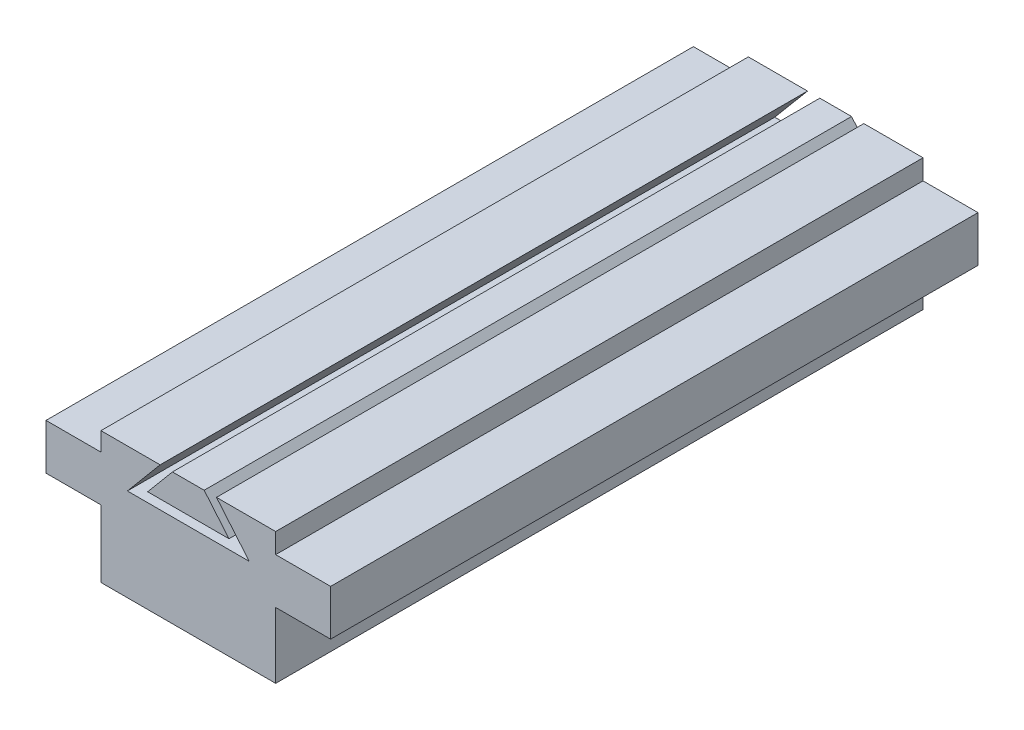
ISO-10303-21;
HEADER;
FILE_DESCRIPTION(('STEP AP214'),'2;1');
FILE_NAME('part.step','',(''),(''),'','','');
FILE_SCHEMA(('AUTOMOTIVE_DESIGN { 1 0 10303 214 1 1 1 1 }'));
ENDSEC;
DATA;
#1=APPLICATION_CONTEXT('core data for automotive mechanical design processes');
#2=APPLICATION_PROTOCOL_DEFINITION('international standard','automotive_design',2000,#1);
#3=PRODUCT_CONTEXT('',#1,'mechanical');
#4=PRODUCT('Part','Part','',(#3));
#5=PRODUCT_RELATED_PRODUCT_CATEGORY('part','',(#4));
#6=PRODUCT_DEFINITION_FORMATION('','',#4);
#7=PRODUCT_DEFINITION_CONTEXT('part definition',#1,'design');
#8=PRODUCT_DEFINITION('design','',#6,#7);
#9=PRODUCT_DEFINITION_SHAPE('','',#8);
#10=(LENGTH_UNIT() NAMED_UNIT(*) SI_UNIT(.MILLI.,.METRE.));
#11=(NAMED_UNIT(*) PLANE_ANGLE_UNIT() SI_UNIT($,.RADIAN.));
#12=(NAMED_UNIT(*) SI_UNIT($,.STERADIAN.) SOLID_ANGLE_UNIT());
#13=UNCERTAINTY_MEASURE_WITH_UNIT(LENGTH_MEASURE(1.E-05),#10,'distance_accuracy_value','');
#14=(GEOMETRIC_REPRESENTATION_CONTEXT(3) GLOBAL_UNCERTAINTY_ASSIGNED_CONTEXT((#13)) GLOBAL_UNIT_ASSIGNED_CONTEXT((#10,
#11,#12)) REPRESENTATION_CONTEXT('',''));
#15=CARTESIAN_POINT('',(0.,0.,0.));
#16=DIRECTION('',(0.,0.,1.));
#17=DIRECTION('',(1.,0.,0.));
#18=AXIS2_PLACEMENT_3D('',#15,#16,#17);
#19=CARTESIAN_POINT('',(2.3615959512271,0.,-5.91156217103304));
#20=DIRECTION('',(1.,0.,0.));
#21=DIRECTION('',(0.,1.,0.));
#22=AXIS2_PLACEMENT_3D('',#19,#20,#21);
#23=PLANE('',#22);
#24=DIRECTION('',(0.,1.,0.));
#25=VECTOR('',#24,1.);
#26=CARTESIAN_POINT('',(2.3615959512271,0.,0.));
#27=LINE('',#26,#25);
#28=CARTESIAN_POINT('',(2.3615959512271,-3.555000078,0.));
#29=VERTEX_POINT('',#28);
#30=CARTESIAN_POINT('',(2.3615959512271,-1.7770265920253,0.));
#31=VERTEX_POINT('',#30);
#32=EDGE_CURVE('E191',#29,#31,#27,.T.);
#33=ORIENTED_EDGE('',*,*,#32,.T.);
#34=DIRECTION('',(0.,0.,1.));
#35=VECTOR('',#34,1.);
#36=CARTESIAN_POINT('',(2.3615959512271,-1.7770265920253,-1.93215123491172));
#37=LINE('',#36,#35);
#38=CARTESIAN_POINT('',(2.3615959512271,-1.7770265920253,17.5));
#39=VERTEX_POINT('',#38);
#40=EDGE_CURVE('E185',#31,#39,#37,.T.);
#41=ORIENTED_EDGE('',*,*,#40,.T.);
#42=DIRECTION('',(0.,1.,0.));
#43=VECTOR('',#42,1.);
#44=CARTESIAN_POINT('',(2.3615959512271,0.,17.5));
#45=LINE('',#44,#43);
#46=CARTESIAN_POINT('',(2.3615959512271,-3.555000078,17.5));
#47=VERTEX_POINT('',#46);
#48=EDGE_CURVE('E278',#47,#39,#45,.T.);
#49=ORIENTED_EDGE('',*,*,#48,.F.);
#50=DIRECTION('',(0.,0.,1.));
#51=VECTOR('',#50,1.);
#52=CARTESIAN_POINT('',(2.3615959512271,-3.555000078,-5.91156217103304));
#53=LINE('',#52,#51);
#54=EDGE_CURVE('E192',#29,#47,#53,.T.);
#55=ORIENTED_EDGE('',*,*,#54,.F.);
#56=EDGE_LOOP('',(#33,#41,#49,#55));
#57=FACE_BOUND('',#56,.T.);
#58=ADVANCED_FACE('F51',(#57),#23,.T.);
#59=CARTESIAN_POINT('',(-2.36159595122709,-3.555000078,-5.91156217103304));
#60=DIRECTION('',(-1.,0.,0.));
#61=DIRECTION('',(0.,0.,1.));
#62=AXIS2_PLACEMENT_3D('',#59,#60,#61);
#63=PLANE('',#62);
#64=DIRECTION('',(0.,-1.,0.));
#65=VECTOR('',#64,1.);
#66=CARTESIAN_POINT('',(-2.36159595122709,-3.555000078,0.));
#67=LINE('',#66,#65);
#68=CARTESIAN_POINT('',(-2.36159595122709,0.,0.));
#69=VERTEX_POINT('',#68);
#70=CARTESIAN_POINT('',(-2.36159595122709,-0.502629726502587,0.));
#71=VERTEX_POINT('',#70);
#72=EDGE_CURVE('E225',#69,#71,#67,.T.);
#73=ORIENTED_EDGE('',*,*,#72,.T.);
#74=DIRECTION('',(0.,0.,1.));
#75=VECTOR('',#74,1.);
#76=CARTESIAN_POINT('',(-2.36159595122709,-0.502629726502587,-1.93215123491172));
#77=LINE('',#76,#75);
#78=CARTESIAN_POINT('',(-2.36159595122709,-0.502629726502587,17.5));
#79=VERTEX_POINT('',#78);
#80=EDGE_CURVE('E296',#71,#79,#77,.T.);
#81=ORIENTED_EDGE('',*,*,#80,.T.);
#82=DIRECTION('',(0.,-1.,0.));
#83=VECTOR('',#82,1.);
#84=CARTESIAN_POINT('',(-2.36159595122709,-3.555000078,17.5));
#85=LINE('',#84,#83);
#86=CARTESIAN_POINT('',(-2.36159595122709,0.,17.5));
#87=VERTEX_POINT('',#86);
#88=EDGE_CURVE('E288',#87,#79,#85,.T.);
#89=ORIENTED_EDGE('',*,*,#88,.F.);
#90=DIRECTION('',(0.,0.,1.));
#91=VECTOR('',#90,1.);
#92=CARTESIAN_POINT('',(-2.36159595122709,0.,-5.91156217103304));
#93=LINE('',#92,#91);
#94=EDGE_CURVE('E12',#69,#87,#93,.T.);
#95=ORIENTED_EDGE('',*,*,#94,.F.);
#96=EDGE_LOOP('',(#73,#81,#89,#95));
#97=FACE_BOUND('',#96,.T.);
#98=ADVANCED_FACE('F313',(#97),#63,.T.);
#99=CARTESIAN_POINT('',(0.,0.,0.));
#100=DIRECTION('',(0.,0.,-1.));
#101=DIRECTION('',(-1.,0.,0.));
#102=AXIS2_PLACEMENT_3D('',#99,#100,#101);
#103=PLANE('',#102);
#104=DIRECTION('',(-1.,0.,0.));
#105=VECTOR('',#104,1.);
#106=CARTESIAN_POINT('',(-2.36159595122709,0.,0.));
#107=LINE('',#106,#105);
#108=CARTESIAN_POINT('',(-0.761599151227094,0.,0.));
#109=VERTEX_POINT('',#108);
#110=EDGE_CURVE('E60',#109,#69,#107,.T.);
#111=ORIENTED_EDGE('',*,*,#110,.F.);
#112=DIRECTION('',(0.642787609686538,0.766044443118979,0.));
#113=VECTOR('',#112,1.);
#114=CARTESIAN_POINT('',(-0.761599151227094,0.,0.));
#115=LINE('',#114,#113);
#116=CARTESIAN_POINT('',(-1.64684926044092,-1.054999998,0.));
#117=VERTEX_POINT('',#116);
#118=EDGE_CURVE('E210',#117,#109,#115,.T.);
#119=ORIENTED_EDGE('',*,*,#118,.F.);
#120=DIRECTION('',(-1.,0.,0.));
#121=VECTOR('',#120,1.);
#122=CARTESIAN_POINT('',(-1.64684926044092,-1.054999998,0.));
#123=LINE('',#122,#121);
#124=CARTESIAN_POINT('',(1.64684926044092,-1.054999998,0.));
#125=VERTEX_POINT('',#124);
#126=EDGE_CURVE('E214',#125,#117,#123,.T.);
#127=ORIENTED_EDGE('',*,*,#126,.F.);
#128=DIRECTION('',(0.642787609686539,-0.766044443118979,0.));
#129=VECTOR('',#128,1.);
#130=CARTESIAN_POINT('',(1.64684926044092,-1.054999998,0.));
#131=LINE('',#130,#129);
#132=CARTESIAN_POINT('',(0.761599151227095,0.,0.));
#133=VERTEX_POINT('',#132);
#134=EDGE_CURVE('E218',#133,#125,#131,.T.);
#135=ORIENTED_EDGE('',*,*,#134,.F.);
#136=DIRECTION('',(-1.,0.,0.));
#137=VECTOR('',#136,1.);
#138=CARTESIAN_POINT('',(0.761599151227095,0.,0.));
#139=LINE('',#138,#137);
#140=CARTESIAN_POINT('',(2.3615959512271,0.,0.));
#141=VERTEX_POINT('',#140);
#142=EDGE_CURVE('E188',#141,#133,#139,.T.);
#143=ORIENTED_EDGE('',*,*,#142,.F.);
#144=CARTESIAN_POINT('',(2.3615959512271,-0.541379584025303,0.));
#145=VERTEX_POINT('',#144);
#146=EDGE_CURVE('E181',#145,#141,#27,.T.);
#147=ORIENTED_EDGE('',*,*,#146,.F.);
#148=DIRECTION('',(-1.,0.,0.));
#149=VECTOR('',#148,1.);
#150=CARTESIAN_POINT('',(3.8469864272271,-0.541379584025303,0.));
#151=LINE('',#150,#149);
#152=CARTESIAN_POINT('',(3.8469864272271,-0.541379584025303,0.));
#153=VERTEX_POINT('',#152);
#154=EDGE_CURVE('E165',#153,#145,#151,.T.);
#155=ORIENTED_EDGE('',*,*,#154,.F.);
#156=DIRECTION('',(0.,1.,0.));
#157=VECTOR('',#156,1.);
#158=CARTESIAN_POINT('',(3.8469864272271,-0.541379584025303,0.));
#159=LINE('',#158,#157);
#160=CARTESIAN_POINT('',(3.8469864272271,-1.7770265920253,0.));
#161=VERTEX_POINT('',#160);
#162=EDGE_CURVE('E352',#161,#153,#159,.T.);
#163=ORIENTED_EDGE('',*,*,#162,.F.);
#164=DIRECTION('',(1.,0.,0.));
#165=VECTOR('',#164,1.);
#166=CARTESIAN_POINT('',(3.8469864272271,-1.7770265920253,0.));
#167=LINE('',#166,#165);
#168=EDGE_CURVE('E343',#31,#161,#167,.T.);
#169=ORIENTED_EDGE('',*,*,#168,.F.);
#170=ORIENTED_EDGE('',*,*,#32,.F.);
#171=DIRECTION('',(1.,0.,0.));
#172=VECTOR('',#171,1.);
#173=CARTESIAN_POINT('',(2.3615959512271,-3.555000078,0.));
#174=LINE('',#173,#172);
#175=CARTESIAN_POINT('',(-2.36159595122709,-3.555000078,0.));
#176=VERTEX_POINT('',#175);
#177=EDGE_CURVE('E198',#176,#29,#174,.T.);
#178=ORIENTED_EDGE('',*,*,#177,.F.);
#179=CARTESIAN_POINT('',(-2.36159595122709,-1.73827673450259,0.));
#180=VERTEX_POINT('',#179);
#181=EDGE_CURVE('E232',#180,#176,#67,.T.);
#182=ORIENTED_EDGE('',*,*,#181,.F.);
#183=DIRECTION('',(1.,0.,0.));
#184=VECTOR('',#183,1.);
#185=CARTESIAN_POINT('',(-2.36159595122709,-1.73827673450259,0.));
#186=LINE('',#185,#184);
#187=CARTESIAN_POINT('',(-3.84698642722709,-1.73827673450259,0.));
#188=VERTEX_POINT('',#187);
#189=EDGE_CURVE('E302',#188,#180,#186,.T.);
#190=ORIENTED_EDGE('',*,*,#189,.F.);
#191=DIRECTION('',(0.,-1.,0.));
#192=VECTOR('',#191,1.);
#193=CARTESIAN_POINT('',(-3.84698642722709,-0.502629726502587,0.));
#194=LINE('',#193,#192);
#195=CARTESIAN_POINT('',(-3.84698642722709,-0.502629726502587,0.));
#196=VERTEX_POINT('',#195);
#197=EDGE_CURVE('E369',#196,#188,#194,.T.);
#198=ORIENTED_EDGE('',*,*,#197,.F.);
#199=DIRECTION('',(-1.,0.,0.));
#200=VECTOR('',#199,1.);
#201=CARTESIAN_POINT('',(-2.36159595122709,-0.502629726502587,0.));
#202=LINE('',#201,#200);
#203=EDGE_CURVE('E356',#71,#196,#202,.T.);
#204=ORIENTED_EDGE('',*,*,#203,.F.);
#205=ORIENTED_EDGE('',*,*,#72,.F.);
#206=EDGE_LOOP('',(#111,#119,#127,#135,#143,#147,#155,#163,#169,#170,#178,#182,#190,#198,#204,#205));
#207=FACE_BOUND('',#206,.T.);
#208=ADVANCED_FACE('F53',(#207),#103,.T.);
#209=CARTESIAN_POINT('',(0.,0.,17.5));
#210=DIRECTION('',(0.,0.,-1.));
#211=DIRECTION('',(-1.,0.,0.));
#212=AXIS2_PLACEMENT_3D('',#209,#210,#211);
#213=PLANE('',#212);
#214=DIRECTION('',(-1.,0.,0.));
#215=VECTOR('',#214,1.);
#216=CARTESIAN_POINT('',(-2.36159595122709,0.,17.5));
#217=LINE('',#216,#215);
#218=CARTESIAN_POINT('',(-0.761599151227094,0.,17.5));
#219=VERTEX_POINT('',#218);
#220=EDGE_CURVE('E240',#219,#87,#217,.T.);
#221=ORIENTED_EDGE('',*,*,#220,.T.);
#222=ORIENTED_EDGE('',*,*,#88,.T.);
#223=DIRECTION('',(-1.,0.,0.));
#224=VECTOR('',#223,1.);
#225=CARTESIAN_POINT('',(-2.36159595122709,-0.502629726502587,17.5));
#226=LINE('',#225,#224);
#227=CARTESIAN_POINT('',(-3.84698642722709,-0.502629726502587,17.5));
#228=VERTEX_POINT('',#227);
#229=EDGE_CURVE('E75',#79,#228,#226,.T.);
#230=ORIENTED_EDGE('',*,*,#229,.T.);
#231=DIRECTION('',(0.,-1.,0.));
#232=VECTOR('',#231,1.);
#233=CARTESIAN_POINT('',(-3.84698642722709,-0.502629726502587,17.5));
#234=LINE('',#233,#232);
#235=CARTESIAN_POINT('',(-3.84698642722709,-1.73827673450259,17.5));
#236=VERTEX_POINT('',#235);
#237=EDGE_CURVE('E357',#228,#236,#234,.T.);
#238=ORIENTED_EDGE('',*,*,#237,.T.);
#239=DIRECTION('',(1.,0.,0.));
#240=VECTOR('',#239,1.);
#241=CARTESIAN_POINT('',(-2.36159595122709,-1.73827673450259,17.5));
#242=LINE('',#241,#240);
#243=CARTESIAN_POINT('',(-2.36159595122709,-1.73827673450259,17.5));
#244=VERTEX_POINT('',#243);
#245=EDGE_CURVE('E353',#236,#244,#242,.T.);
#246=ORIENTED_EDGE('',*,*,#245,.T.);
#247=CARTESIAN_POINT('',(-2.36159595122709,-3.555000078,17.5));
#248=VERTEX_POINT('',#247);
#249=EDGE_CURVE('E291',#244,#248,#85,.T.);
#250=ORIENTED_EDGE('',*,*,#249,.T.);
#251=DIRECTION('',(1.,0.,0.));
#252=VECTOR('',#251,1.);
#253=CARTESIAN_POINT('',(2.3615959512271,-3.555000078,17.5));
#254=LINE('',#253,#252);
#255=EDGE_CURVE('E285',#248,#47,#254,.T.);
#256=ORIENTED_EDGE('',*,*,#255,.T.);
#257=ORIENTED_EDGE('',*,*,#48,.T.);
#258=DIRECTION('',(1.,0.,0.));
#259=VECTOR('',#258,1.);
#260=CARTESIAN_POINT('',(3.8469864272271,-1.7770265920253,17.5));
#261=LINE('',#260,#259);
#262=CARTESIAN_POINT('',(3.8469864272271,-1.7770265920253,17.5));
#263=VERTEX_POINT('',#262);
#264=EDGE_CURVE('E67',#39,#263,#261,.T.);
#265=ORIENTED_EDGE('',*,*,#264,.T.);
#266=DIRECTION('',(0.,1.,0.));
#267=VECTOR('',#266,1.);
#268=CARTESIAN_POINT('',(3.8469864272271,-0.541379584025303,17.5));
#269=LINE('',#268,#267);
#270=CARTESIAN_POINT('',(3.8469864272271,-0.541379584025303,17.5));
#271=VERTEX_POINT('',#270);
#272=EDGE_CURVE('E572',#263,#271,#269,.T.);
#273=ORIENTED_EDGE('',*,*,#272,.T.);
#274=DIRECTION('',(-1.,0.,0.));
#275=VECTOR('',#274,1.);
#276=CARTESIAN_POINT('',(3.8469864272271,-0.541379584025303,17.5));
#277=LINE('',#276,#275);
#278=CARTESIAN_POINT('',(2.3615959512271,-0.541379584025303,17.5));
#279=VERTEX_POINT('',#278);
#280=EDGE_CURVE('E576',#271,#279,#277,.T.);
#281=ORIENTED_EDGE('',*,*,#280,.T.);
#282=CARTESIAN_POINT('',(2.3615959512271,0.,17.5));
#283=VERTEX_POINT('',#282);
#284=EDGE_CURVE('E183',#279,#283,#45,.T.);
#285=ORIENTED_EDGE('',*,*,#284,.T.);
#286=DIRECTION('',(-1.,0.,0.));
#287=VECTOR('',#286,1.);
#288=CARTESIAN_POINT('',(0.761599151227095,0.,17.5));
#289=LINE('',#288,#287);
#290=CARTESIAN_POINT('',(0.761599151227095,0.,17.5));
#291=VERTEX_POINT('',#290);
#292=EDGE_CURVE('E274',#283,#291,#289,.T.);
#293=ORIENTED_EDGE('',*,*,#292,.T.);
#294=DIRECTION('',(0.642787609686539,-0.766044443118979,0.));
#295=VECTOR('',#294,1.);
#296=CARTESIAN_POINT('',(1.64684926044092,-1.054999998,17.5));
#297=LINE('',#296,#295);
#298=CARTESIAN_POINT('',(1.64684926044092,-1.054999998,17.5));
#299=VERTEX_POINT('',#298);
#300=EDGE_CURVE('E268',#291,#299,#297,.T.);
#301=ORIENTED_EDGE('',*,*,#300,.T.);
#302=DIRECTION('',(-1.,0.,0.));
#303=VECTOR('',#302,1.);
#304=CARTESIAN_POINT('',(-1.64684926044092,-1.054999998,17.5));
#305=LINE('',#304,#303);
#306=CARTESIAN_POINT('',(-1.64684926044092,-1.054999998,17.5));
#307=VERTEX_POINT('',#306);
#308=EDGE_CURVE('E262',#299,#307,#305,.T.);
#309=ORIENTED_EDGE('',*,*,#308,.T.);
#310=DIRECTION('',(0.642787609686538,0.766044443118979,0.));
#311=VECTOR('',#310,1.);
#312=CARTESIAN_POINT('',(-0.761599151227094,0.,17.5));
#313=LINE('',#312,#311);
#314=EDGE_CURVE('E237',#307,#219,#313,.T.);
#315=ORIENTED_EDGE('',*,*,#314,.T.);
#316=EDGE_LOOP('',(#221,#222,#230,#238,#246,#250,#256,#257,#265,#273,#281,#285,#293,#301,#309,#315));
#317=FACE_BOUND('',#316,.T.);
#318=ADVANCED_FACE('F272',(#317),#213,.F.);
#319=DIRECTION('',(0.,0.,1.));
#320=VECTOR('',#319,1.);
#321=CARTESIAN_POINT('',(-2.36159595122709,-1.73827673450259,-1.93215123491172));
#322=LINE('',#321,#320);
#323=EDGE_CURVE('E299',#180,#244,#322,.T.);
#324=ORIENTED_EDGE('',*,*,#323,.F.);
#325=ORIENTED_EDGE('',*,*,#181,.T.);
#326=DIRECTION('',(0.,0.,1.));
#327=VECTOR('',#326,1.);
#328=CARTESIAN_POINT('',(-2.36159595122709,-3.555000078,-5.91156217103304));
#329=LINE('',#328,#327);
#330=EDGE_CURVE('E206',#176,#248,#329,.T.);
#331=ORIENTED_EDGE('',*,*,#330,.T.);
#332=ORIENTED_EDGE('',*,*,#249,.F.);
#333=EDGE_LOOP('',(#324,#325,#331,#332));
#334=FACE_BOUND('',#333,.T.);
#335=ADVANCED_FACE('F315',(#334),#63,.T.);
#336=CARTESIAN_POINT('',(2.3615959512271,-3.555000078,-5.91156217103304));
#337=DIRECTION('',(0.,-1.,0.));
#338=DIRECTION('',(1.,0.,0.));
#339=AXIS2_PLACEMENT_3D('',#336,#337,#338);
#340=PLANE('',#339);
#341=CARTESIAN_POINT('',(0.,-3.555000078,16.0870141807737));
#342=DIRECTION('',(0.,-1.,0.));
#343=DIRECTION('',(1.,0.,0.));
#344=AXIS2_PLACEMENT_3D('',#341,#342,#343);
#345=CIRCLE('',#344,0.677079946819119);
#346=CARTESIAN_POINT('',(0.67707994681912,-3.555000078,16.0870141807737));
#347=VERTEX_POINT('',#346);
#348=EDGE_CURVE('E567',#347,#347,#345,.T.);
#349=ORIENTED_EDGE('',*,*,#348,.F.);
#350=EDGE_LOOP('',(#349));
#351=FACE_BOUND('',#350,.T.);
#352=CARTESIAN_POINT('',(0.,-3.555000078,12.2770141807737));
#353=DIRECTION('',(0.,-1.,0.));
#354=DIRECTION('',(1.,0.,0.));
#355=AXIS2_PLACEMENT_3D('',#352,#353,#354);
#356=CIRCLE('',#355,0.677079946819119);
#357=CARTESIAN_POINT('',(0.677079946819119,-3.555000078,12.2770141807737));
#358=VERTEX_POINT('',#357);
#359=EDGE_CURVE('E581',#358,#358,#356,.T.);
#360=ORIENTED_EDGE('',*,*,#359,.F.);
#361=EDGE_LOOP('',(#360));
#362=FACE_BOUND('',#361,.T.);
#363=CARTESIAN_POINT('',(0.,-3.555000078,8.46701418077369));
#364=DIRECTION('',(0.,-1.,0.));
#365=DIRECTION('',(1.,0.,0.));
#366=AXIS2_PLACEMENT_3D('',#363,#364,#365);
#367=CIRCLE('',#366,0.677079946819119);
#368=CARTESIAN_POINT('',(0.677079946819119,-3.555000078,8.46701418077369));
#369=VERTEX_POINT('',#368);
#370=EDGE_CURVE('E589',#369,#369,#367,.T.);
#371=ORIENTED_EDGE('',*,*,#370,.F.);
#372=EDGE_LOOP('',(#371));
#373=FACE_BOUND('',#372,.T.);
#374=CARTESIAN_POINT('',(0.,-3.555000078,4.65701418077369));
#375=DIRECTION('',(0.,-1.,0.));
#376=DIRECTION('',(1.,0.,0.));
#377=AXIS2_PLACEMENT_3D('',#374,#375,#376);
#378=CIRCLE('',#377,0.677079946819119);
#379=CARTESIAN_POINT('',(0.677079946819119,-3.555000078,4.65701418077369));
#380=VERTEX_POINT('',#379);
#381=EDGE_CURVE('E597',#380,#380,#378,.T.);
#382=ORIENTED_EDGE('',*,*,#381,.F.);
#383=EDGE_LOOP('',(#382));
#384=FACE_BOUND('',#383,.T.);
#385=ORIENTED_EDGE('',*,*,#330,.F.);
#386=ORIENTED_EDGE('',*,*,#177,.T.);
#387=ORIENTED_EDGE('',*,*,#54,.T.);
#388=ORIENTED_EDGE('',*,*,#255,.F.);
#389=EDGE_LOOP('',(#385,#386,#387,#388));
#390=FACE_BOUND('',#389,.T.);
#391=ADVANCED_FACE('F324',(#351,#362,#373,#384,#390),#340,.T.);
#392=DIRECTION('',(0.,0.,1.));
#393=VECTOR('',#392,1.);
#394=CARTESIAN_POINT('',(2.3615959512271,-0.541379584025303,-1.93215123491172));
#395=LINE('',#394,#393);
#396=EDGE_CURVE('E169',#145,#279,#395,.T.);
#397=ORIENTED_EDGE('',*,*,#396,.F.);
#398=ORIENTED_EDGE('',*,*,#146,.T.);
#399=DIRECTION('',(0.,0.,1.));
#400=VECTOR('',#399,1.);
#401=CARTESIAN_POINT('',(2.3615959512271,0.,-5.91156217103304));
#402=LINE('',#401,#400);
#403=EDGE_CURVE('E197',#141,#283,#402,.T.);
#404=ORIENTED_EDGE('',*,*,#403,.T.);
#405=ORIENTED_EDGE('',*,*,#284,.F.);
#406=EDGE_LOOP('',(#397,#398,#404,#405));
#407=FACE_BOUND('',#406,.T.);
#408=ADVANCED_FACE('F179',(#407),#23,.T.);
#409=CARTESIAN_POINT('',(0.761599151227095,0.,-5.91156217103304));
#410=DIRECTION('',(0.,1.,0.));
#411=DIRECTION('',(0.,0.,1.));
#412=AXIS2_PLACEMENT_3D('',#409,#410,#411);
#413=PLANE('',#412);
#414=ORIENTED_EDGE('',*,*,#403,.F.);
#415=ORIENTED_EDGE('',*,*,#142,.T.);
#416=DIRECTION('',(0.,0.,1.));
#417=VECTOR('',#416,1.);
#418=CARTESIAN_POINT('',(0.761599151227095,0.,-5.91156217103304));
#419=LINE('',#418,#417);
#420=EDGE_CURVE('E219',#133,#291,#419,.T.);
#421=ORIENTED_EDGE('',*,*,#420,.T.);
#422=ORIENTED_EDGE('',*,*,#292,.F.);
#423=EDGE_LOOP('',(#414,#415,#421,#422));
#424=FACE_BOUND('',#423,.T.);
#425=ADVANCED_FACE('F401',(#424),#413,.T.);
#426=CARTESIAN_POINT('',(1.64684926044092,-1.054999998,-5.91156217103304));
#427=DIRECTION('',(-0.766044443118979,-0.642787609686539,0.));
#428=DIRECTION('',(0.642787609686539,-0.766044443118979,0.));
#429=AXIS2_PLACEMENT_3D('',#426,#427,#428);
#430=PLANE('',#429);
#431=ORIENTED_EDGE('',*,*,#420,.F.);
#432=ORIENTED_EDGE('',*,*,#134,.T.);
#433=DIRECTION('',(0.,0.,1.));
#434=VECTOR('',#433,1.);
#435=CARTESIAN_POINT('',(1.64684926044092,-1.054999998,-5.91156217103304));
#436=LINE('',#435,#434);
#437=EDGE_CURVE('E215',#125,#299,#436,.T.);
#438=ORIENTED_EDGE('',*,*,#437,.T.);
#439=ORIENTED_EDGE('',*,*,#300,.F.);
#440=EDGE_LOOP('',(#431,#432,#438,#439));
#441=FACE_BOUND('',#440,.T.);
#442=ADVANCED_FACE('F254',(#441),#430,.T.);
#443=CARTESIAN_POINT('',(-1.64684926044092,-1.054999998,-5.91156217103304));
#444=DIRECTION('',(0.,1.,0.));
#445=DIRECTION('',(0.,0.,1.));
#446=AXIS2_PLACEMENT_3D('',#443,#444,#445);
#447=PLANE('',#446);
#448=CARTESIAN_POINT('',(0.,-1.054999998,16.0870141807737));
#449=DIRECTION('',(0.,1.,0.));
#450=DIRECTION('',(0.,0.,1.));
#451=AXIS2_PLACEMENT_3D('',#448,#449,#450);
#452=CIRCLE('',#451,0.677079946819119);
#453=CARTESIAN_POINT('',(0.,-1.054999998,16.7640941275928));
#454=VERTEX_POINT('',#453);
#455=EDGE_CURVE('E570',#454,#454,#452,.F.);
#456=ORIENTED_EDGE('',*,*,#455,.T.);
#457=EDGE_LOOP('',(#456));
#458=FACE_BOUND('',#457,.T.);
#459=CARTESIAN_POINT('',(0.,-1.054999998,12.2770141807737));
#460=DIRECTION('',(0.,1.,0.));
#461=DIRECTION('',(0.,0.,1.));
#462=AXIS2_PLACEMENT_3D('',#459,#460,#461);
#463=CIRCLE('',#462,0.677079946819119);
#464=CARTESIAN_POINT('',(0.,-1.054999998,12.9540941275928));
#465=VERTEX_POINT('',#464);
#466=EDGE_CURVE('E578',#465,#465,#463,.F.);
#467=ORIENTED_EDGE('',*,*,#466,.T.);
#468=EDGE_LOOP('',(#467));
#469=FACE_BOUND('',#468,.T.);
#470=CARTESIAN_POINT('',(0.,-1.054999998,8.46701418077369));
#471=DIRECTION('',(0.,1.,0.));
#472=DIRECTION('',(0.,0.,1.));
#473=AXIS2_PLACEMENT_3D('',#470,#471,#472);
#474=CIRCLE('',#473,0.677079946819119);
#475=CARTESIAN_POINT('',(0.,-1.054999998,9.14409412759281));
#476=VERTEX_POINT('',#475);
#477=EDGE_CURVE('E585',#476,#476,#474,.F.);
#478=ORIENTED_EDGE('',*,*,#477,.T.);
#479=EDGE_LOOP('',(#478));
#480=FACE_BOUND('',#479,.T.);
#481=CARTESIAN_POINT('',(0.,-1.054999998,4.65701418077369));
#482=DIRECTION('',(0.,1.,0.));
#483=DIRECTION('',(0.,0.,1.));
#484=AXIS2_PLACEMENT_3D('',#481,#482,#483);
#485=CIRCLE('',#484,0.677079946819119);
#486=CARTESIAN_POINT('',(0.,-1.054999998,5.33409412759281));
#487=VERTEX_POINT('',#486);
#488=EDGE_CURVE('E593',#487,#487,#485,.F.);
#489=ORIENTED_EDGE('',*,*,#488,.T.);
#490=EDGE_LOOP('',(#489));
#491=FACE_BOUND('',#490,.T.);
#492=ORIENTED_EDGE('',*,*,#437,.F.);
#493=ORIENTED_EDGE('',*,*,#126,.T.);
#494=DIRECTION('',(0.,0.,1.));
#495=VECTOR('',#494,1.);
#496=CARTESIAN_POINT('',(-1.64684926044092,-1.054999998,-5.91156217103304));
#497=LINE('',#496,#495);
#498=EDGE_CURVE('E211',#117,#307,#497,.T.);
#499=ORIENTED_EDGE('',*,*,#498,.T.);
#500=ORIENTED_EDGE('',*,*,#308,.F.);
#501=EDGE_LOOP('',(#492,#493,#499,#500));
#502=FACE_BOUND('',#501,.T.);
#503=ADVANCED_FACE('F260',(#458,#469,#480,#491,#502),#447,.T.);
#504=CARTESIAN_POINT('',(-0.761599151227094,0.,-5.91156217103304));
#505=DIRECTION('',(0.766044443118979,-0.642787609686538,0.));
#506=DIRECTION('',(0.642787609686538,0.766044443118979,0.));
#507=AXIS2_PLACEMENT_3D('',#504,#505,#506);
#508=PLANE('',#507);
#509=ORIENTED_EDGE('',*,*,#498,.F.);
#510=ORIENTED_EDGE('',*,*,#118,.T.);
#511=DIRECTION('',(0.,0.,1.));
#512=VECTOR('',#511,1.);
#513=CARTESIAN_POINT('',(-0.761599151227094,0.,-5.91156217103304));
#514=LINE('',#513,#512);
#515=EDGE_CURVE('E207',#109,#219,#514,.T.);
#516=ORIENTED_EDGE('',*,*,#515,.T.);
#517=ORIENTED_EDGE('',*,*,#314,.F.);
#518=EDGE_LOOP('',(#509,#510,#516,#517));
#519=FACE_BOUND('',#518,.T.);
#520=ADVANCED_FACE('F309',(#519),#508,.T.);
#521=CARTESIAN_POINT('',(-2.36159595122709,0.,-5.91156217103304));
#522=DIRECTION('',(0.,1.,0.));
#523=DIRECTION('',(0.,0.,1.));
#524=AXIS2_PLACEMENT_3D('',#521,#522,#523);
#525=PLANE('',#524);
#526=ORIENTED_EDGE('',*,*,#515,.F.);
#527=ORIENTED_EDGE('',*,*,#110,.T.);
#528=ORIENTED_EDGE('',*,*,#94,.T.);
#529=ORIENTED_EDGE('',*,*,#220,.F.);
#530=EDGE_LOOP('',(#526,#527,#528,#529));
#531=FACE_BOUND('',#530,.T.);
#532=ADVANCED_FACE('F312',(#531),#525,.T.);
#533=CARTESIAN_POINT('',(-2.36159595122709,-0.502629726502587,-1.93215123491172));
#534=DIRECTION('',(0.,1.,0.));
#535=DIRECTION('',(-1.,0.,0.));
#536=AXIS2_PLACEMENT_3D('',#533,#534,#535);
#537=PLANE('',#536);
#538=ORIENTED_EDGE('',*,*,#80,.F.);
#539=ORIENTED_EDGE('',*,*,#203,.T.);
#540=DIRECTION('',(0.,0.,1.));
#541=VECTOR('',#540,1.);
#542=CARTESIAN_POINT('',(-3.84698642722709,-0.502629726502587,-1.93215123491172));
#543=LINE('',#542,#541);
#544=EDGE_CURVE('E305',#196,#228,#543,.T.);
#545=ORIENTED_EDGE('',*,*,#544,.T.);
#546=ORIENTED_EDGE('',*,*,#229,.F.);
#547=EDGE_LOOP('',(#538,#539,#545,#546));
#548=FACE_BOUND('',#547,.T.);
#549=ADVANCED_FACE('F386',(#548),#537,.T.);
#550=CARTESIAN_POINT('',(-3.84698642722709,-0.502629726502587,-1.93215123491172));
#551=DIRECTION('',(-1.,0.,0.));
#552=DIRECTION('',(0.,0.,1.));
#553=AXIS2_PLACEMENT_3D('',#550,#551,#552);
#554=PLANE('',#553);
#555=ORIENTED_EDGE('',*,*,#544,.F.);
#556=ORIENTED_EDGE('',*,*,#197,.T.);
#557=DIRECTION('',(0.,0.,1.));
#558=VECTOR('',#557,1.);
#559=CARTESIAN_POINT('',(-3.84698642722709,-1.73827673450259,-1.93215123491172));
#560=LINE('',#559,#558);
#561=EDGE_CURVE('E368',#188,#236,#560,.T.);
#562=ORIENTED_EDGE('',*,*,#561,.T.);
#563=ORIENTED_EDGE('',*,*,#237,.F.);
#564=EDGE_LOOP('',(#555,#556,#562,#563));
#565=FACE_BOUND('',#564,.T.);
#566=ADVANCED_FACE('F376',(#565),#554,.T.);
#567=CARTESIAN_POINT('',(-2.36159595122709,-1.73827673450259,-1.93215123491172));
#568=DIRECTION('',(0.,-1.,0.));
#569=DIRECTION('',(1.,0.,0.));
#570=AXIS2_PLACEMENT_3D('',#567,#568,#569);
#571=PLANE('',#570);
#572=ORIENTED_EDGE('',*,*,#561,.F.);
#573=ORIENTED_EDGE('',*,*,#189,.T.);
#574=ORIENTED_EDGE('',*,*,#323,.T.);
#575=ORIENTED_EDGE('',*,*,#245,.F.);
#576=EDGE_LOOP('',(#572,#573,#574,#575));
#577=FACE_BOUND('',#576,.T.);
#578=ADVANCED_FACE('F377',(#577),#571,.T.);
#579=CARTESIAN_POINT('',(3.8469864272271,-0.541379584025303,-1.93215123491172));
#580=DIRECTION('',(0.,1.,0.));
#581=DIRECTION('',(-1.,0.,0.));
#582=AXIS2_PLACEMENT_3D('',#579,#580,#581);
#583=PLANE('',#582);
#584=DIRECTION('',(0.,0.,1.));
#585=VECTOR('',#584,1.);
#586=CARTESIAN_POINT('',(3.8469864272271,-0.541379584025303,-1.93215123491172));
#587=LINE('',#586,#585);
#588=EDGE_CURVE('E171',#153,#271,#587,.T.);
#589=ORIENTED_EDGE('',*,*,#588,.F.);
#590=ORIENTED_EDGE('',*,*,#154,.T.);
#591=ORIENTED_EDGE('',*,*,#396,.T.);
#592=ORIENTED_EDGE('',*,*,#280,.F.);
#593=EDGE_LOOP('',(#589,#590,#591,#592));
#594=FACE_BOUND('',#593,.T.);
#595=ADVANCED_FACE('F167',(#594),#583,.T.);
#596=CARTESIAN_POINT('',(3.8469864272271,-1.7770265920253,-1.93215123491172));
#597=DIRECTION('',(0.,-1.,0.));
#598=DIRECTION('',(1.,0.,0.));
#599=AXIS2_PLACEMENT_3D('',#596,#597,#598);
#600=PLANE('',#599);
#601=ORIENTED_EDGE('',*,*,#40,.F.);
#602=ORIENTED_EDGE('',*,*,#168,.T.);
#603=DIRECTION('',(0.,0.,1.));
#604=VECTOR('',#603,1.);
#605=CARTESIAN_POINT('',(3.8469864272271,-1.7770265920253,-1.93215123491172));
#606=LINE('',#605,#604);
#607=EDGE_CURVE('E346',#161,#263,#606,.T.);
#608=ORIENTED_EDGE('',*,*,#607,.T.);
#609=ORIENTED_EDGE('',*,*,#264,.F.);
#610=EDGE_LOOP('',(#601,#602,#608,#609));
#611=FACE_BOUND('',#610,.T.);
#612=ADVANCED_FACE('F384',(#611),#600,.T.);
#613=CARTESIAN_POINT('',(3.8469864272271,-0.541379584025303,-1.93215123491172));
#614=DIRECTION('',(1.,0.,0.));
#615=DIRECTION('',(0.,1.,0.));
#616=AXIS2_PLACEMENT_3D('',#613,#614,#615);
#617=PLANE('',#616);
#618=ORIENTED_EDGE('',*,*,#607,.F.);
#619=ORIENTED_EDGE('',*,*,#162,.T.);
#620=ORIENTED_EDGE('',*,*,#588,.T.);
#621=ORIENTED_EDGE('',*,*,#272,.F.);
#622=EDGE_LOOP('',(#618,#619,#620,#621));
#623=FACE_BOUND('',#622,.T.);
#624=ADVANCED_FACE('F458',(#623),#617,.T.);
#625=CARTESIAN_POINT('',(0.,0.860071289204906,4.65701418077369));
#626=DIRECTION('',(0.,-1.,0.));
#627=DIRECTION('',(1.,0.,0.));
#628=AXIS2_PLACEMENT_3D('',#625,#626,#627);
#629=CYLINDRICAL_SURFACE('',#628,0.677079946819119);
#630=ORIENTED_EDGE('',*,*,#381,.T.);
#631=EDGE_LOOP('',(#630));
#632=FACE_BOUND('',#631,.T.);
#633=ORIENTED_EDGE('',*,*,#488,.F.);
#634=EDGE_LOOP('',(#633));
#635=FACE_BOUND('',#634,.T.);
#636=ADVANCED_FACE('F465',(#632,#635),#629,.F.);
#637=CARTESIAN_POINT('',(0.,0.860071289204906,8.46701418077369));
#638=DIRECTION('',(0.,-1.,0.));
#639=DIRECTION('',(1.,0.,0.));
#640=AXIS2_PLACEMENT_3D('',#637,#638,#639);
#641=CYLINDRICAL_SURFACE('',#640,0.677079946819119);
#642=ORIENTED_EDGE('',*,*,#370,.T.);
#643=EDGE_LOOP('',(#642));
#644=FACE_BOUND('',#643,.T.);
#645=ORIENTED_EDGE('',*,*,#477,.F.);
#646=EDGE_LOOP('',(#645));
#647=FACE_BOUND('',#646,.T.);
#648=ADVANCED_FACE('F530',(#644,#647),#641,.F.);
#649=CARTESIAN_POINT('',(0.,0.860071289204906,12.2770141807737));
#650=DIRECTION('',(0.,-1.,0.));
#651=DIRECTION('',(1.,0.,0.));
#652=AXIS2_PLACEMENT_3D('',#649,#650,#651);
#653=CYLINDRICAL_SURFACE('',#652,0.677079946819119);
#654=ORIENTED_EDGE('',*,*,#359,.T.);
#655=EDGE_LOOP('',(#654));
#656=FACE_BOUND('',#655,.T.);
#657=ORIENTED_EDGE('',*,*,#466,.F.);
#658=EDGE_LOOP('',(#657));
#659=FACE_BOUND('',#658,.T.);
#660=ADVANCED_FACE('F537',(#656,#659),#653,.F.);
#661=CARTESIAN_POINT('',(0.,0.860071289204906,16.0870141807737));
#662=DIRECTION('',(0.,-1.,0.));
#663=DIRECTION('',(1.,0.,0.));
#664=AXIS2_PLACEMENT_3D('',#661,#662,#663);
#665=CYLINDRICAL_SURFACE('',#664,0.677079946819119);
#666=ORIENTED_EDGE('',*,*,#348,.T.);
#667=EDGE_LOOP('',(#666));
#668=FACE_BOUND('',#667,.T.);
#669=ORIENTED_EDGE('',*,*,#455,.F.);
#670=EDGE_LOOP('',(#669));
#671=FACE_BOUND('',#670,.T.);
#672=ADVANCED_FACE('F545',(#668,#671),#665,.F.);
#673=CLOSED_SHELL('',(#58,#98,#208,#318,#335,#391,#408,#425,#442,#503,#520,#532,#549,#566,#578,
#595,#612,#624,#636,#648,#660,#672));
#674=MANIFOLD_SOLID_BREP('B2',#673);
#675=CARTESIAN_POINT('',(-1.1,-0.8,17.5));
#676=DIRECTION('',(0.766044443118979,-0.642787609686538,0.));
#677=DIRECTION('',(0.642787609686538,0.766044443118979,0.));
#678=AXIS2_PLACEMENT_3D('',#675,#676,#677);
#679=PLANE('',#678);
#680=DIRECTION('',(-0.642787609686538,-0.766044443118979,0.));
#681=VECTOR('',#680,1.);
#682=CARTESIAN_POINT('',(-1.1,-0.8,0.));
#683=LINE('',#682,#681);
#684=CARTESIAN_POINT('',(-0.428720295058179,0.,0.));
#685=VERTEX_POINT('',#684);
#686=CARTESIAN_POINT('',(-1.1,-0.8,0.));
#687=VERTEX_POINT('',#686);
#688=EDGE_CURVE('E695',#685,#687,#683,.T.);
#689=ORIENTED_EDGE('',*,*,#688,.T.);
#690=DIRECTION('',(0.,0.,-1.));
#691=VECTOR('',#690,1.);
#692=CARTESIAN_POINT('',(-1.1,-0.8,17.5));
#693=LINE('',#692,#691);
#694=CARTESIAN_POINT('',(-1.1,-0.8,17.5));
#695=VERTEX_POINT('',#694);
#696=EDGE_CURVE('E49',#695,#687,#693,.T.);
#697=ORIENTED_EDGE('',*,*,#696,.F.);
#698=DIRECTION('',(-0.642787609686538,-0.766044443118979,0.));
#699=VECTOR('',#698,1.);
#700=CARTESIAN_POINT('',(-1.1,-0.8,17.5));
#701=LINE('',#700,#699);
#702=CARTESIAN_POINT('',(-0.428720295058179,0.,17.5));
#703=VERTEX_POINT('',#702);
#704=EDGE_CURVE('E683',#703,#695,#701,.T.);
#705=ORIENTED_EDGE('',*,*,#704,.F.);
#706=DIRECTION('',(0.,0.,-1.));
#707=VECTOR('',#706,1.);
#708=CARTESIAN_POINT('',(-0.428720295058179,0.,17.5));
#709=LINE('',#708,#707);
#710=EDGE_CURVE('E691',#703,#685,#709,.T.);
#711=ORIENTED_EDGE('',*,*,#710,.T.);
#712=EDGE_LOOP('',(#689,#697,#705,#711));
#713=FACE_BOUND('',#712,.T.);
#714=ADVANCED_FACE('F632',(#713),#679,.F.);
#715=CARTESIAN_POINT('',(1.1,-0.799999999999999,17.5));
#716=DIRECTION('',(0.,1.,0.));
#717=DIRECTION('',(-1.,0.,0.));
#718=AXIS2_PLACEMENT_3D('',#715,#716,#717);
#719=PLANE('',#718);
#720=DIRECTION('',(1.,0.,0.));
#721=VECTOR('',#720,1.);
#722=CARTESIAN_POINT('',(1.1,-0.799999999999999,0.));
#723=LINE('',#722,#721);
#724=CARTESIAN_POINT('',(1.1,-0.799999999999999,0.));
#725=VERTEX_POINT('',#724);
#726=EDGE_CURVE('E687',#687,#725,#723,.T.);
#727=ORIENTED_EDGE('',*,*,#726,.T.);
#728=DIRECTION('',(0.,0.,-1.));
#729=VECTOR('',#728,1.);
#730=CARTESIAN_POINT('',(1.1,-0.799999999999999,17.5));
#731=LINE('',#730,#729);
#732=CARTESIAN_POINT('',(1.1,-0.799999999999999,17.5));
#733=VERTEX_POINT('',#732);
#734=EDGE_CURVE('E640',#733,#725,#731,.T.);
#735=ORIENTED_EDGE('',*,*,#734,.F.);
#736=DIRECTION('',(1.,0.,0.));
#737=VECTOR('',#736,1.);
#738=CARTESIAN_POINT('',(1.1,-0.799999999999999,17.5));
#739=LINE('',#738,#737);
#740=EDGE_CURVE('E678',#695,#733,#739,.T.);
#741=ORIENTED_EDGE('',*,*,#740,.F.);
#742=ORIENTED_EDGE('',*,*,#696,.T.);
#743=EDGE_LOOP('',(#727,#735,#741,#742));
#744=FACE_BOUND('',#743,.T.);
#745=ADVANCED_FACE('F686',(#744),#719,.F.);
#746=CARTESIAN_POINT('',(0.428720295058179,0.,17.5));
#747=DIRECTION('',(-0.766044443118979,-0.642787609686539,0.));
#748=DIRECTION('',(0.642787609686539,-0.766044443118979,0.));
#749=AXIS2_PLACEMENT_3D('',#746,#747,#748);
#750=PLANE('',#749);
#751=DIRECTION('',(-0.642787609686539,0.766044443118979,0.));
#752=VECTOR('',#751,1.);
#753=CARTESIAN_POINT('',(0.428720295058179,0.,0.));
#754=LINE('',#753,#752);
#755=CARTESIAN_POINT('',(0.428720295058179,0.,0.));
#756=VERTEX_POINT('',#755);
#757=EDGE_CURVE('E665',#725,#756,#754,.T.);
#758=ORIENTED_EDGE('',*,*,#757,.T.);
#759=DIRECTION('',(0.,0.,-1.));
#760=VECTOR('',#759,1.);
#761=CARTESIAN_POINT('',(0.428720295058179,0.,17.5));
#762=LINE('',#761,#760);
#763=CARTESIAN_POINT('',(0.428720295058179,0.,17.5));
#764=VERTEX_POINT('',#763);
#765=EDGE_CURVE('E688',#764,#756,#762,.T.);
#766=ORIENTED_EDGE('',*,*,#765,.F.);
#767=DIRECTION('',(-0.642787609686539,0.766044443118979,0.));
#768=VECTOR('',#767,1.);
#769=CARTESIAN_POINT('',(0.428720295058179,0.,17.5));
#770=LINE('',#769,#768);
#771=EDGE_CURVE('E681',#733,#764,#770,.T.);
#772=ORIENTED_EDGE('',*,*,#771,.F.);
#773=ORIENTED_EDGE('',*,*,#734,.T.);
#774=EDGE_LOOP('',(#758,#766,#772,#773));
#775=FACE_BOUND('',#774,.T.);
#776=ADVANCED_FACE('F689',(#775),#750,.F.);
#777=CARTESIAN_POINT('',(-0.428720295058179,0.,17.5));
#778=DIRECTION('',(0.,-1.,0.));
#779=DIRECTION('',(1.,0.,0.));
#780=AXIS2_PLACEMENT_3D('',#777,#778,#779);
#781=PLANE('',#780);
#782=DIRECTION('',(-1.,0.,0.));
#783=VECTOR('',#782,1.);
#784=CARTESIAN_POINT('',(-0.428720295058179,0.,0.));
#785=LINE('',#784,#783);
#786=EDGE_CURVE('E671',#756,#685,#785,.T.);
#787=ORIENTED_EDGE('',*,*,#786,.T.);
#788=ORIENTED_EDGE('',*,*,#710,.F.);
#789=DIRECTION('',(-1.,0.,0.));
#790=VECTOR('',#789,1.);
#791=CARTESIAN_POINT('',(-0.428720295058179,0.,17.5));
#792=LINE('',#791,#790);
#793=EDGE_CURVE('E648',#764,#703,#792,.T.);
#794=ORIENTED_EDGE('',*,*,#793,.F.);
#795=ORIENTED_EDGE('',*,*,#765,.T.);
#796=EDGE_LOOP('',(#787,#788,#794,#795));
#797=FACE_BOUND('',#796,.T.);
#798=ADVANCED_FACE('F702',(#797),#781,.F.);
#799=CARTESIAN_POINT('',(0.,0.,17.5));
#800=DIRECTION('',(0.,0.,-1.));
#801=DIRECTION('',(-1.,0.,0.));
#802=AXIS2_PLACEMENT_3D('',#799,#800,#801);
#803=PLANE('',#802);
#804=ORIENTED_EDGE('',*,*,#704,.T.);
#805=ORIENTED_EDGE('',*,*,#740,.T.);
#806=ORIENTED_EDGE('',*,*,#771,.T.);
#807=ORIENTED_EDGE('',*,*,#793,.T.);
#808=EDGE_LOOP('',(#804,#805,#806,#807));
#809=FACE_BOUND('',#808,.T.);
#810=ADVANCED_FACE('F679',(#809),#803,.F.);
#811=CARTESIAN_POINT('',(0.,0.,0.));
#812=DIRECTION('',(0.,0.,-1.));
#813=DIRECTION('',(-1.,0.,0.));
#814=AXIS2_PLACEMENT_3D('',#811,#812,#813);
#815=PLANE('',#814);
#816=ORIENTED_EDGE('',*,*,#688,.F.);
#817=ORIENTED_EDGE('',*,*,#786,.F.);
#818=ORIENTED_EDGE('',*,*,#757,.F.);
#819=ORIENTED_EDGE('',*,*,#726,.F.);
#820=EDGE_LOOP('',(#816,#817,#818,#819));
#821=FACE_BOUND('',#820,.T.);
#822=ADVANCED_FACE('F705',(#821),#815,.T.);
#823=CLOSED_SHELL('',(#714,#745,#776,#798,#810,#822));
#824=MANIFOLD_SOLID_BREP('B6',#823);
#825=ADVANCED_BREP_SHAPE_REPRESENTATION('',(#18,#674,#824),#14);
#826=SHAPE_DEFINITION_REPRESENTATION(#9,#825);
ENDSEC;
END-ISO-10303-21;
